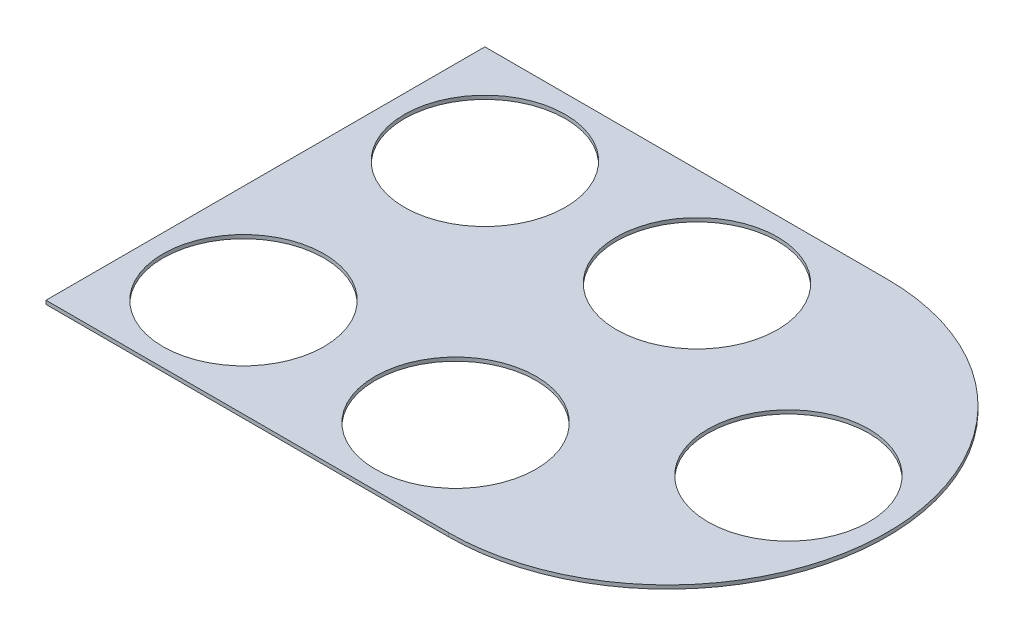
ISO-10303-21;
HEADER;
FILE_DESCRIPTION(('STEP AP214'),'2;1');
FILE_NAME('part.step','',(''),(''),'','','');
FILE_SCHEMA(('AUTOMOTIVE_DESIGN { 1 0 10303 214 1 1 1 1 }'));
ENDSEC;
DATA;
#1=APPLICATION_CONTEXT('core data for automotive mechanical design processes');
#2=APPLICATION_PROTOCOL_DEFINITION('international standard','automotive_design',2000,#1);
#3=PRODUCT_CONTEXT('',#1,'mechanical');
#4=PRODUCT('Part','Part','',(#3));
#5=PRODUCT_RELATED_PRODUCT_CATEGORY('part','',(#4));
#6=PRODUCT_DEFINITION_FORMATION('','',#4);
#7=PRODUCT_DEFINITION_CONTEXT('part definition',#1,'design');
#8=PRODUCT_DEFINITION('design','',#6,#7);
#9=PRODUCT_DEFINITION_SHAPE('','',#8);
#10=(LENGTH_UNIT() NAMED_UNIT(*) SI_UNIT(.MILLI.,.METRE.));
#11=(NAMED_UNIT(*) PLANE_ANGLE_UNIT() SI_UNIT($,.RADIAN.));
#12=(NAMED_UNIT(*) SI_UNIT($,.STERADIAN.) SOLID_ANGLE_UNIT());
#13=UNCERTAINTY_MEASURE_WITH_UNIT(LENGTH_MEASURE(1.E-05),#10,'distance_accuracy_value','');
#14=(GEOMETRIC_REPRESENTATION_CONTEXT(3) GLOBAL_UNCERTAINTY_ASSIGNED_CONTEXT((#13)) GLOBAL_UNIT_ASSIGNED_CONTEXT((#10,
#11,#12)) REPRESENTATION_CONTEXT('',''));
#15=CARTESIAN_POINT('',(0.,0.,0.));
#16=DIRECTION('',(0.,0.,1.));
#17=DIRECTION('',(1.,0.,0.));
#18=AXIS2_PLACEMENT_3D('',#15,#16,#17);
#19=CARTESIAN_POINT('',(279.4,2.54,-152.4));
#20=DIRECTION('',(0.,1.,0.));
#21=DIRECTION('',(0.,0.,1.));
#22=AXIS2_PLACEMENT_3D('',#19,#20,#21);
#23=PLANE('',#22);
#24=CARTESIAN_POINT('',(68.58,2.54,-68.58));
#25=DIRECTION('',(0.,1.,0.));
#26=DIRECTION('',(0.,0.,-1.));
#27=AXIS2_PLACEMENT_3D('',#24,#25,#26);
#28=CIRCLE('',#27,55.88);
#29=CARTESIAN_POINT('',(68.58,2.54,-124.46));
#30=VERTEX_POINT('',#29);
#31=EDGE_CURVE('E127',#30,#30,#28,.T.);
#32=ORIENTED_EDGE('',*,*,#31,.F.);
#33=EDGE_LOOP('',(#32));
#34=FACE_BOUND('',#33,.T.);
#35=CARTESIAN_POINT('',(215.9,2.54,-236.22));
#36=DIRECTION('',(0.,1.,0.));
#37=DIRECTION('',(0.,0.,1.));
#38=AXIS2_PLACEMENT_3D('',#35,#36,#37);
#39=CIRCLE('',#38,55.88);
#40=CARTESIAN_POINT('',(215.9,2.54,-180.34));
#41=VERTEX_POINT('',#40);
#42=EDGE_CURVE('E115',#41,#41,#39,.T.);
#43=ORIENTED_EDGE('',*,*,#42,.F.);
#44=EDGE_LOOP('',(#43));
#45=FACE_BOUND('',#44,.T.);
#46=DIRECTION('',(0.,0.,1.));
#47=VECTOR('',#46,1.);
#48=CARTESIAN_POINT('',(0.,2.54,0.));
#49=LINE('',#48,#47);
#50=CARTESIAN_POINT('',(0.,2.54,-304.8));
#51=VERTEX_POINT('',#50);
#52=CARTESIAN_POINT('',(0.,2.54,0.));
#53=VERTEX_POINT('',#52);
#54=EDGE_CURVE('E85',#51,#53,#49,.T.);
#55=ORIENTED_EDGE('',*,*,#54,.T.);
#56=DIRECTION('',(1.,0.,0.));
#57=VECTOR('',#56,1.);
#58=CARTESIAN_POINT('',(0.,2.54,0.));
#59=LINE('',#58,#57);
#60=CARTESIAN_POINT('',(279.4,2.54,0.));
#61=VERTEX_POINT('',#60);
#62=EDGE_CURVE('E80',#53,#61,#59,.T.);
#63=ORIENTED_EDGE('',*,*,#62,.T.);
#64=CARTESIAN_POINT('',(279.4,2.54,-152.4));
#65=DIRECTION('',(0.,1.,0.));
#66=DIRECTION('',(0.,0.,1.));
#67=AXIS2_PLACEMENT_3D('',#64,#65,#66);
#68=CIRCLE('',#67,152.4);
#69=CARTESIAN_POINT('',(279.4,2.54,-304.8));
#70=VERTEX_POINT('',#69);
#71=EDGE_CURVE('E83',#61,#70,#68,.T.);
#72=ORIENTED_EDGE('',*,*,#71,.T.);
#73=DIRECTION('',(-1.,0.,0.));
#74=VECTOR('',#73,1.);
#75=CARTESIAN_POINT('',(0.,2.54,-304.8));
#76=LINE('',#75,#74);
#77=EDGE_CURVE('E50',#70,#51,#76,.T.);
#78=ORIENTED_EDGE('',*,*,#77,.T.);
#79=EDGE_LOOP('',(#55,#63,#72,#78));
#80=FACE_BOUND('',#79,.T.);
#81=CARTESIAN_POINT('',(68.58,2.54,-236.22));
#82=DIRECTION('',(0.,1.,0.));
#83=DIRECTION('',(0.,0.,1.));
#84=AXIS2_PLACEMENT_3D('',#81,#82,#83);
#85=CIRCLE('',#84,55.88);
#86=CARTESIAN_POINT('',(68.58,2.54,-180.34));
#87=VERTEX_POINT('',#86);
#88=EDGE_CURVE('E100',#87,#87,#85,.T.);
#89=ORIENTED_EDGE('',*,*,#88,.F.);
#90=EDGE_LOOP('',(#89));
#91=FACE_BOUND('',#90,.T.);
#92=CARTESIAN_POINT('',(363.22,2.54,-152.4));
#93=DIRECTION('',(0.,1.,0.));
#94=DIRECTION('',(0.,0.,1.));
#95=AXIS2_PLACEMENT_3D('',#92,#93,#94);
#96=CIRCLE('',#95,55.88);
#97=CARTESIAN_POINT('',(363.22,2.54,-96.52));
#98=VERTEX_POINT('',#97);
#99=EDGE_CURVE('E121',#98,#98,#96,.T.);
#100=ORIENTED_EDGE('',*,*,#99,.F.);
#101=EDGE_LOOP('',(#100));
#102=FACE_BOUND('',#101,.T.);
#103=CARTESIAN_POINT('',(215.9,2.54,-68.58));
#104=DIRECTION('',(0.,1.,0.));
#105=DIRECTION('',(0.,0.,-1.));
#106=AXIS2_PLACEMENT_3D('',#103,#104,#105);
#107=CIRCLE('',#106,55.88);
#108=CARTESIAN_POINT('',(215.9,2.54,-124.46));
#109=VERTEX_POINT('',#108);
#110=EDGE_CURVE('E133',#109,#109,#107,.T.);
#111=ORIENTED_EDGE('',*,*,#110,.F.);
#112=EDGE_LOOP('',(#111));
#113=FACE_BOUND('',#112,.T.);
#114=ADVANCED_FACE('F33',(#34,#45,#80,#91,#102,#113),#23,.T.);
#115=CARTESIAN_POINT('',(279.4,0.,-152.4));
#116=DIRECTION('',(0.,1.,0.));
#117=DIRECTION('',(0.,0.,1.));
#118=AXIS2_PLACEMENT_3D('',#115,#116,#117);
#119=PLANE('',#118);
#120=CARTESIAN_POINT('',(68.58,0.,-68.58));
#121=DIRECTION('',(0.,1.,0.));
#122=DIRECTION('',(0.,0.,-1.));
#123=AXIS2_PLACEMENT_3D('',#120,#121,#122);
#124=CIRCLE('',#123,55.88);
#125=CARTESIAN_POINT('',(68.58,0.,-124.46));
#126=VERTEX_POINT('',#125);
#127=EDGE_CURVE('E130',#126,#126,#124,.T.);
#128=ORIENTED_EDGE('',*,*,#127,.T.);
#129=EDGE_LOOP('',(#128));
#130=FACE_BOUND('',#129,.T.);
#131=CARTESIAN_POINT('',(215.9,0.,-236.22));
#132=DIRECTION('',(0.,1.,0.));
#133=DIRECTION('',(0.,0.,1.));
#134=AXIS2_PLACEMENT_3D('',#131,#132,#133);
#135=CIRCLE('',#134,55.88);
#136=CARTESIAN_POINT('',(215.9,0.,-180.34));
#137=VERTEX_POINT('',#136);
#138=EDGE_CURVE('E118',#137,#137,#135,.T.);
#139=ORIENTED_EDGE('',*,*,#138,.T.);
#140=EDGE_LOOP('',(#139));
#141=FACE_BOUND('',#140,.T.);
#142=DIRECTION('',(0.,0.,1.));
#143=VECTOR('',#142,1.);
#144=CARTESIAN_POINT('',(0.,0.,0.));
#145=LINE('',#144,#143);
#146=CARTESIAN_POINT('',(0.,0.,-304.8));
#147=VERTEX_POINT('',#146);
#148=CARTESIAN_POINT('',(0.,0.,0.));
#149=VERTEX_POINT('',#148);
#150=EDGE_CURVE('E97',#147,#149,#145,.T.);
#151=ORIENTED_EDGE('',*,*,#150,.F.);
#152=DIRECTION('',(-1.,0.,0.));
#153=VECTOR('',#152,1.);
#154=CARTESIAN_POINT('',(0.,0.,-304.8));
#155=LINE('',#154,#153);
#156=CARTESIAN_POINT('',(279.4,0.,-304.8));
#157=VERTEX_POINT('',#156);
#158=EDGE_CURVE('E73',#157,#147,#155,.T.);
#159=ORIENTED_EDGE('',*,*,#158,.F.);
#160=CARTESIAN_POINT('',(279.4,0.,-152.4));
#161=DIRECTION('',(0.,1.,0.));
#162=DIRECTION('',(0.,0.,1.));
#163=AXIS2_PLACEMENT_3D('',#160,#161,#162);
#164=CIRCLE('',#163,152.4);
#165=CARTESIAN_POINT('',(279.4,0.,0.));
#166=VERTEX_POINT('',#165);
#167=EDGE_CURVE('E67',#166,#157,#164,.T.);
#168=ORIENTED_EDGE('',*,*,#167,.F.);
#169=DIRECTION('',(1.,0.,0.));
#170=VECTOR('',#169,1.);
#171=CARTESIAN_POINT('',(0.,0.,0.));
#172=LINE('',#171,#170);
#173=EDGE_CURVE('E89',#149,#166,#172,.T.);
#174=ORIENTED_EDGE('',*,*,#173,.F.);
#175=EDGE_LOOP('',(#151,#159,#168,#174));
#176=FACE_BOUND('',#175,.T.);
#177=CARTESIAN_POINT('',(68.58,0.,-236.22));
#178=DIRECTION('',(0.,1.,0.));
#179=DIRECTION('',(0.,0.,1.));
#180=AXIS2_PLACEMENT_3D('',#177,#178,#179);
#181=CIRCLE('',#180,55.88);
#182=CARTESIAN_POINT('',(68.58,0.,-180.34));
#183=VERTEX_POINT('',#182);
#184=EDGE_CURVE('E112',#183,#183,#181,.T.);
#185=ORIENTED_EDGE('',*,*,#184,.T.);
#186=EDGE_LOOP('',(#185));
#187=FACE_BOUND('',#186,.T.);
#188=CARTESIAN_POINT('',(363.22,0.,-152.4));
#189=DIRECTION('',(0.,1.,0.));
#190=DIRECTION('',(0.,0.,1.));
#191=AXIS2_PLACEMENT_3D('',#188,#189,#190);
#192=CIRCLE('',#191,55.88);
#193=CARTESIAN_POINT('',(363.22,0.,-96.52));
#194=VERTEX_POINT('',#193);
#195=EDGE_CURVE('E124',#194,#194,#192,.T.);
#196=ORIENTED_EDGE('',*,*,#195,.T.);
#197=EDGE_LOOP('',(#196));
#198=FACE_BOUND('',#197,.T.);
#199=CARTESIAN_POINT('',(215.9,0.,-68.58));
#200=DIRECTION('',(0.,1.,0.));
#201=DIRECTION('',(0.,0.,-1.));
#202=AXIS2_PLACEMENT_3D('',#199,#200,#201);
#203=CIRCLE('',#202,55.88);
#204=CARTESIAN_POINT('',(215.9,0.,-124.46));
#205=VERTEX_POINT('',#204);
#206=EDGE_CURVE('E136',#205,#205,#203,.T.);
#207=ORIENTED_EDGE('',*,*,#206,.T.);
#208=EDGE_LOOP('',(#207));
#209=FACE_BOUND('',#208,.T.);
#210=ADVANCED_FACE('F108',(#130,#141,#176,#187,#198,#209),#119,.F.);
#211=CARTESIAN_POINT('',(0.,2.54,0.));
#212=DIRECTION('',(1.,0.,0.));
#213=DIRECTION('',(0.,0.,-1.));
#214=AXIS2_PLACEMENT_3D('',#211,#212,#213);
#215=PLANE('',#214);
#216=ORIENTED_EDGE('',*,*,#150,.T.);
#217=DIRECTION('',(0.,-1.,0.));
#218=VECTOR('',#217,1.);
#219=CARTESIAN_POINT('',(0.,2.54,0.));
#220=LINE('',#219,#218);
#221=EDGE_CURVE('E11',#53,#149,#220,.T.);
#222=ORIENTED_EDGE('',*,*,#221,.F.);
#223=ORIENTED_EDGE('',*,*,#54,.F.);
#224=DIRECTION('',(0.,-1.,0.));
#225=VECTOR('',#224,1.);
#226=CARTESIAN_POINT('',(0.,2.54,-304.8));
#227=LINE('',#226,#225);
#228=EDGE_CURVE('E93',#51,#147,#227,.T.);
#229=ORIENTED_EDGE('',*,*,#228,.T.);
#230=EDGE_LOOP('',(#216,#222,#223,#229));
#231=FACE_BOUND('',#230,.T.);
#232=ADVANCED_FACE('F35',(#231),#215,.F.);
#233=CARTESIAN_POINT('',(0.,2.54,0.));
#234=DIRECTION('',(0.,0.,-1.));
#235=DIRECTION('',(-1.,0.,0.));
#236=AXIS2_PLACEMENT_3D('',#233,#234,#235);
#237=PLANE('',#236);
#238=ORIENTED_EDGE('',*,*,#173,.T.);
#239=DIRECTION('',(0.,-1.,0.));
#240=VECTOR('',#239,1.);
#241=CARTESIAN_POINT('',(279.4,2.54,0.));
#242=LINE('',#241,#240);
#243=EDGE_CURVE('E42',#61,#166,#242,.T.);
#244=ORIENTED_EDGE('',*,*,#243,.F.);
#245=ORIENTED_EDGE('',*,*,#62,.F.);
#246=ORIENTED_EDGE('',*,*,#221,.T.);
#247=EDGE_LOOP('',(#238,#244,#245,#246));
#248=FACE_BOUND('',#247,.T.);
#249=ADVANCED_FACE('F88',(#248),#237,.F.);
#250=CARTESIAN_POINT('',(279.4,2.54,-152.4));
#251=DIRECTION('',(0.,-1.,0.));
#252=DIRECTION('',(0.,0.,-1.));
#253=AXIS2_PLACEMENT_3D('',#250,#251,#252);
#254=CYLINDRICAL_SURFACE('',#253,152.4);
#255=ORIENTED_EDGE('',*,*,#167,.T.);
#256=DIRECTION('',(0.,-1.,0.));
#257=VECTOR('',#256,1.);
#258=CARTESIAN_POINT('',(279.4,2.54,-304.8));
#259=LINE('',#258,#257);
#260=EDGE_CURVE('E90',#70,#157,#259,.T.);
#261=ORIENTED_EDGE('',*,*,#260,.F.);
#262=ORIENTED_EDGE('',*,*,#71,.F.);
#263=ORIENTED_EDGE('',*,*,#243,.T.);
#264=EDGE_LOOP('',(#255,#261,#262,#263));
#265=FACE_BOUND('',#264,.T.);
#266=ADVANCED_FACE('F91',(#265),#254,.T.);
#267=CARTESIAN_POINT('',(0.,2.54,-304.8));
#268=DIRECTION('',(0.,0.,1.));
#269=DIRECTION('',(1.,0.,0.));
#270=AXIS2_PLACEMENT_3D('',#267,#268,#269);
#271=PLANE('',#270);
#272=ORIENTED_EDGE('',*,*,#158,.T.);
#273=ORIENTED_EDGE('',*,*,#228,.F.);
#274=ORIENTED_EDGE('',*,*,#77,.F.);
#275=ORIENTED_EDGE('',*,*,#260,.T.);
#276=EDGE_LOOP('',(#272,#273,#274,#275));
#277=FACE_BOUND('',#276,.T.);
#278=ADVANCED_FACE('F105',(#277),#271,.F.);
#279=CARTESIAN_POINT('',(68.58,2.54,-236.22));
#280=DIRECTION('',(0.,-1.,0.));
#281=DIRECTION('',(0.,0.,-1.));
#282=AXIS2_PLACEMENT_3D('',#279,#280,#281);
#283=CYLINDRICAL_SURFACE('',#282,55.88);
#284=ORIENTED_EDGE('',*,*,#88,.T.);
#285=EDGE_LOOP('',(#284));
#286=FACE_BOUND('',#285,.T.);
#287=ORIENTED_EDGE('',*,*,#184,.F.);
#288=EDGE_LOOP('',(#287));
#289=FACE_BOUND('',#288,.T.);
#290=ADVANCED_FACE('F156',(#286,#289),#283,.F.);
#291=CARTESIAN_POINT('',(215.9,2.54,-236.22));
#292=DIRECTION('',(0.,-1.,0.));
#293=DIRECTION('',(0.,0.,-1.));
#294=AXIS2_PLACEMENT_3D('',#291,#292,#293);
#295=CYLINDRICAL_SURFACE('',#294,55.88);
#296=ORIENTED_EDGE('',*,*,#42,.T.);
#297=EDGE_LOOP('',(#296));
#298=FACE_BOUND('',#297,.T.);
#299=ORIENTED_EDGE('',*,*,#138,.F.);
#300=EDGE_LOOP('',(#299));
#301=FACE_BOUND('',#300,.T.);
#302=ADVANCED_FACE('F202',(#298,#301),#295,.F.);
#303=CARTESIAN_POINT('',(363.22,2.54,-152.4));
#304=DIRECTION('',(0.,-1.,0.));
#305=DIRECTION('',(0.,0.,-1.));
#306=AXIS2_PLACEMENT_3D('',#303,#304,#305);
#307=CYLINDRICAL_SURFACE('',#306,55.88);
#308=ORIENTED_EDGE('',*,*,#99,.T.);
#309=EDGE_LOOP('',(#308));
#310=FACE_BOUND('',#309,.T.);
#311=ORIENTED_EDGE('',*,*,#195,.F.);
#312=EDGE_LOOP('',(#311));
#313=FACE_BOUND('',#312,.T.);
#314=ADVANCED_FACE('F210',(#310,#313),#307,.F.);
#315=CARTESIAN_POINT('',(68.58,2.54,-68.58));
#316=DIRECTION('',(0.,-1.,0.));
#317=DIRECTION('',(0.,0.,-1.));
#318=AXIS2_PLACEMENT_3D('',#315,#316,#317);
#319=CYLINDRICAL_SURFACE('',#318,55.88);
#320=ORIENTED_EDGE('',*,*,#31,.T.);
#321=EDGE_LOOP('',(#320));
#322=FACE_BOUND('',#321,.T.);
#323=ORIENTED_EDGE('',*,*,#127,.F.);
#324=EDGE_LOOP('',(#323));
#325=FACE_BOUND('',#324,.T.);
#326=ADVANCED_FACE('F218',(#322,#325),#319,.F.);
#327=CARTESIAN_POINT('',(215.9,2.54,-68.58));
#328=DIRECTION('',(0.,-1.,0.));
#329=DIRECTION('',(0.,0.,-1.));
#330=AXIS2_PLACEMENT_3D('',#327,#328,#329);
#331=CYLINDRICAL_SURFACE('',#330,55.88);
#332=ORIENTED_EDGE('',*,*,#110,.T.);
#333=EDGE_LOOP('',(#332));
#334=FACE_BOUND('',#333,.T.);
#335=ORIENTED_EDGE('',*,*,#206,.F.);
#336=EDGE_LOOP('',(#335));
#337=FACE_BOUND('',#336,.T.);
#338=ADVANCED_FACE('F142',(#334,#337),#331,.F.);
#339=CLOSED_SHELL('',(#114,#210,#232,#249,#266,#278,#290,#302,#314,#326,#338));
#340=MANIFOLD_SOLID_BREP('B2',#339);
#341=ADVANCED_BREP_SHAPE_REPRESENTATION('',(#18,#340),#14);
#342=SHAPE_DEFINITION_REPRESENTATION(#9,#341);
ENDSEC;
END-ISO-10303-21;
